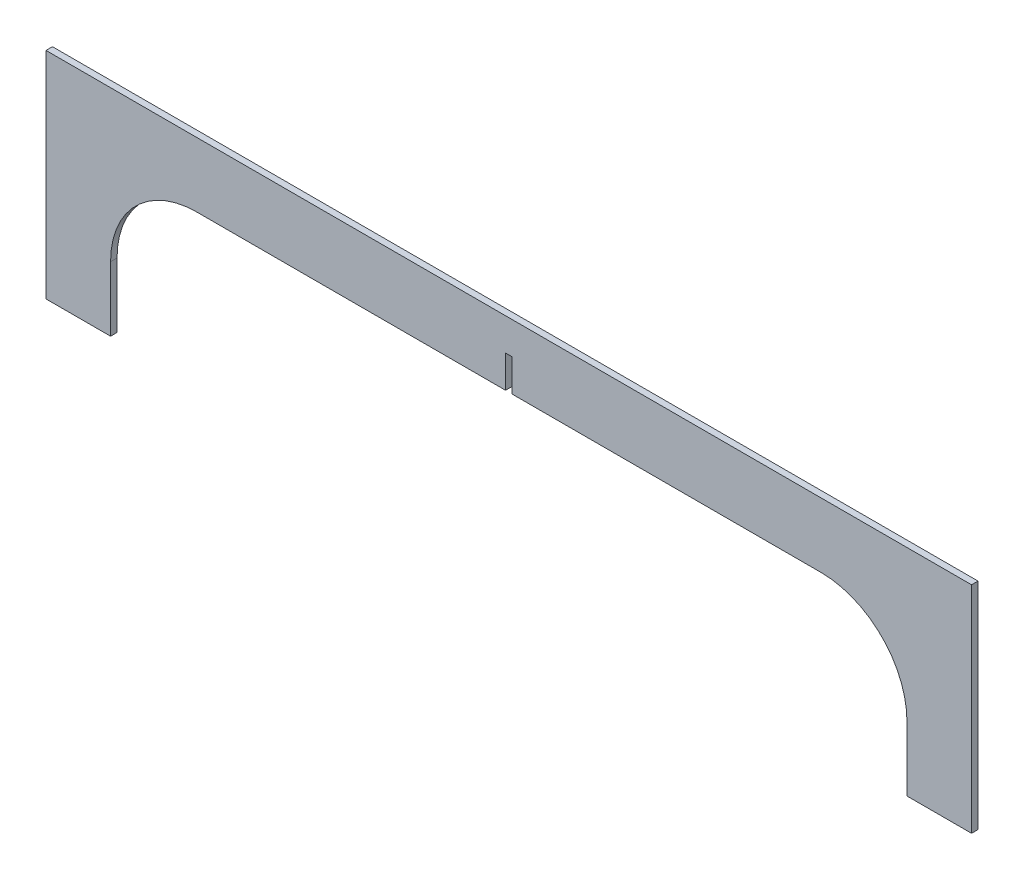
ISO-10303-21;
HEADER;
FILE_DESCRIPTION(('STEP AP214'),'2;1');
FILE_NAME('part.step','',(''),(''),'','','');
FILE_SCHEMA(('AUTOMOTIVE_DESIGN { 1 0 10303 214 1 1 1 1 }'));
ENDSEC;
DATA;
#1=APPLICATION_CONTEXT('core data for automotive mechanical design processes');
#2=APPLICATION_PROTOCOL_DEFINITION('international standard','automotive_design',2000,#1);
#3=PRODUCT_CONTEXT('',#1,'mechanical');
#4=PRODUCT('Part','Part','',(#3));
#5=PRODUCT_RELATED_PRODUCT_CATEGORY('part','',(#4));
#6=PRODUCT_DEFINITION_FORMATION('','',#4);
#7=PRODUCT_DEFINITION_CONTEXT('part definition',#1,'design');
#8=PRODUCT_DEFINITION('design','',#6,#7);
#9=PRODUCT_DEFINITION_SHAPE('','',#8);
#10=(LENGTH_UNIT() NAMED_UNIT(*) SI_UNIT(.MILLI.,.METRE.));
#11=(NAMED_UNIT(*) PLANE_ANGLE_UNIT() SI_UNIT($,.RADIAN.));
#12=(NAMED_UNIT(*) SI_UNIT($,.STERADIAN.) SOLID_ANGLE_UNIT());
#13=UNCERTAINTY_MEASURE_WITH_UNIT(LENGTH_MEASURE(1.E-05),#10,'distance_accuracy_value','');
#14=(GEOMETRIC_REPRESENTATION_CONTEXT(3) GLOBAL_UNCERTAINTY_ASSIGNED_CONTEXT((#13)) GLOBAL_UNIT_ASSIGNED_CONTEXT((#10,
#11,#12)) REPRESENTATION_CONTEXT('',''));
#15=CARTESIAN_POINT('',(0.,0.,0.));
#16=DIRECTION('',(0.,0.,1.));
#17=DIRECTION('',(1.,0.,0.));
#18=AXIS2_PLACEMENT_3D('',#15,#16,#17);
#19=CARTESIAN_POINT('',(30.,0.,3.));
#20=DIRECTION('',(0.,1.,0.));
#21=DIRECTION('',(-1.,0.,0.));
#22=AXIS2_PLACEMENT_3D('',#19,#20,#21);
#23=PLANE('',#22);
#24=DIRECTION('',(1.,0.,0.));
#25=VECTOR('',#24,1.);
#26=CARTESIAN_POINT('',(30.,0.,0.));
#27=LINE('',#26,#25);
#28=CARTESIAN_POINT('',(0.,0.,0.));
#29=VERTEX_POINT('',#28);
#30=CARTESIAN_POINT('',(30.,0.,0.));
#31=VERTEX_POINT('',#30);
#32=EDGE_CURVE('E155',#29,#31,#27,.T.);
#33=ORIENTED_EDGE('',*,*,#32,.T.);
#34=DIRECTION('',(0.,0.,-1.));
#35=VECTOR('',#34,1.);
#36=CARTESIAN_POINT('',(30.,0.,3.));
#37=LINE('',#36,#35);
#38=CARTESIAN_POINT('',(30.,0.,3.));
#39=VERTEX_POINT('',#38);
#40=EDGE_CURVE('E138',#39,#31,#37,.T.);
#41=ORIENTED_EDGE('',*,*,#40,.F.);
#42=DIRECTION('',(1.,0.,0.));
#43=VECTOR('',#42,1.);
#44=CARTESIAN_POINT('',(30.,0.,3.));
#45=LINE('',#44,#43);
#46=CARTESIAN_POINT('',(0.,0.,3.));
#47=VERTEX_POINT('',#46);
#48=EDGE_CURVE('E143',#47,#39,#45,.T.);
#49=ORIENTED_EDGE('',*,*,#48,.F.);
#50=DIRECTION('',(0.,0.,-1.));
#51=VECTOR('',#50,1.);
#52=CARTESIAN_POINT('',(0.,0.,3.));
#53=LINE('',#52,#51);
#54=EDGE_CURVE('E220',#47,#29,#53,.T.);
#55=ORIENTED_EDGE('',*,*,#54,.T.);
#56=EDGE_LOOP('',(#33,#41,#49,#55));
#57=FACE_BOUND('',#56,.T.);
#58=ADVANCED_FACE('F37',(#57),#23,.F.);
#59=CARTESIAN_POINT('',(30.,70.,3.));
#60=DIRECTION('',(-1.,0.,0.));
#61=DIRECTION('',(0.,-1.,0.));
#62=AXIS2_PLACEMENT_3D('',#59,#60,#61);
#63=PLANE('',#62);
#64=DIRECTION('',(0.,1.,0.));
#65=VECTOR('',#64,1.);
#66=CARTESIAN_POINT('',(30.,70.,0.));
#67=LINE('',#66,#65);
#68=CARTESIAN_POINT('',(30.,30.,0.));
#69=VERTEX_POINT('',#68);
#70=EDGE_CURVE('E251',#31,#69,#67,.T.);
#71=ORIENTED_EDGE('',*,*,#70,.T.);
#72=DIRECTION('',(0.,0.,-1.));
#73=VECTOR('',#72,1.);
#74=CARTESIAN_POINT('',(30.,30.,3.));
#75=LINE('',#74,#73);
#76=CARTESIAN_POINT('',(30.,30.,3.));
#77=VERTEX_POINT('',#76);
#78=EDGE_CURVE('E52',#69,#77,#75,.F.);
#79=ORIENTED_EDGE('',*,*,#78,.T.);
#80=DIRECTION('',(0.,1.,0.));
#81=VECTOR('',#80,1.);
#82=CARTESIAN_POINT('',(30.,70.,3.));
#83=LINE('',#82,#81);
#84=EDGE_CURVE('E134',#39,#77,#83,.T.);
#85=ORIENTED_EDGE('',*,*,#84,.F.);
#86=ORIENTED_EDGE('',*,*,#40,.T.);
#87=EDGE_LOOP('',(#71,#79,#85,#86));
#88=FACE_BOUND('',#87,.T.);
#89=ADVANCED_FACE('F136',(#88),#63,.F.);
#90=CARTESIAN_POINT('',(30.,70.,3.));
#91=DIRECTION('',(0.,1.,0.));
#92=DIRECTION('',(0.,0.,1.));
#93=AXIS2_PLACEMENT_3D('',#90,#91,#92);
#94=PLANE('',#93);
#95=DIRECTION('',(1.,0.,0.));
#96=VECTOR('',#95,1.);
#97=CARTESIAN_POINT('',(30.,70.,3.));
#98=LINE('',#97,#96);
#99=CARTESIAN_POINT('',(70.,70.,3.));
#100=VERTEX_POINT('',#99);
#101=CARTESIAN_POINT('',(213.5,70.,3.));
#102=VERTEX_POINT('',#101);
#103=EDGE_CURVE('E142',#100,#102,#98,.T.);
#104=ORIENTED_EDGE('',*,*,#103,.F.);
#105=DIRECTION('',(0.,0.,-1.));
#106=VECTOR('',#105,1.);
#107=CARTESIAN_POINT('',(70.,70.,0.));
#108=LINE('',#107,#106);
#109=CARTESIAN_POINT('',(70.,70.,0.));
#110=VERTEX_POINT('',#109);
#111=EDGE_CURVE('E168',#100,#110,#108,.T.);
#112=ORIENTED_EDGE('',*,*,#111,.T.);
#113=DIRECTION('',(1.,0.,0.));
#114=VECTOR('',#113,1.);
#115=CARTESIAN_POINT('',(30.,70.,0.));
#116=LINE('',#115,#114);
#117=CARTESIAN_POINT('',(213.5,70.,0.));
#118=VERTEX_POINT('',#117);
#119=EDGE_CURVE('E247',#110,#118,#116,.T.);
#120=ORIENTED_EDGE('',*,*,#119,.T.);
#121=DIRECTION('',(0.,0.,-1.));
#122=VECTOR('',#121,1.);
#123=CARTESIAN_POINT('',(213.5,70.,3.));
#124=LINE('',#123,#122);
#125=EDGE_CURVE('E157',#102,#118,#124,.T.);
#126=ORIENTED_EDGE('',*,*,#125,.F.);
#127=EDGE_LOOP('',(#104,#112,#120,#126));
#128=FACE_BOUND('',#127,.T.);
#129=ADVANCED_FACE('F270',(#128),#94,.F.);
#130=CARTESIAN_POINT('',(213.5,70.,3.));
#131=DIRECTION('',(-1.,0.,0.));
#132=DIRECTION('',(0.,0.,1.));
#133=AXIS2_PLACEMENT_3D('',#130,#131,#132);
#134=PLANE('',#133);
#135=DIRECTION('',(0.,1.,0.));
#136=VECTOR('',#135,1.);
#137=CARTESIAN_POINT('',(213.5,70.,0.));
#138=LINE('',#137,#136);
#139=CARTESIAN_POINT('',(213.5,85.,0.));
#140=VERTEX_POINT('',#139);
#141=EDGE_CURVE('E246',#118,#140,#138,.T.);
#142=ORIENTED_EDGE('',*,*,#141,.T.);
#143=DIRECTION('',(0.,0.,-1.));
#144=VECTOR('',#143,1.);
#145=CARTESIAN_POINT('',(213.5,85.,3.));
#146=LINE('',#145,#144);
#147=CARTESIAN_POINT('',(213.5,85.,3.));
#148=VERTEX_POINT('',#147);
#149=EDGE_CURVE('E163',#148,#140,#146,.T.);
#150=ORIENTED_EDGE('',*,*,#149,.F.);
#151=DIRECTION('',(0.,1.,0.));
#152=VECTOR('',#151,1.);
#153=CARTESIAN_POINT('',(213.5,70.,3.));
#154=LINE('',#153,#152);
#155=EDGE_CURVE('E264',#102,#148,#154,.T.);
#156=ORIENTED_EDGE('',*,*,#155,.F.);
#157=ORIENTED_EDGE('',*,*,#125,.T.);
#158=EDGE_LOOP('',(#142,#150,#156,#157));
#159=FACE_BOUND('',#158,.T.);
#160=ADVANCED_FACE('F271',(#159),#134,.F.);
#161=CARTESIAN_POINT('',(213.5,85.,3.));
#162=DIRECTION('',(0.,1.,0.));
#163=DIRECTION('',(0.,0.,1.));
#164=AXIS2_PLACEMENT_3D('',#161,#162,#163);
#165=PLANE('',#164);
#166=DIRECTION('',(1.,0.,0.));
#167=VECTOR('',#166,1.);
#168=CARTESIAN_POINT('',(213.5,85.,0.));
#169=LINE('',#168,#167);
#170=CARTESIAN_POINT('',(216.5,85.,0.));
#171=VERTEX_POINT('',#170);
#172=EDGE_CURVE('E210',#140,#171,#169,.T.);
#173=ORIENTED_EDGE('',*,*,#172,.T.);
#174=DIRECTION('',(0.,0.,-1.));
#175=VECTOR('',#174,1.);
#176=CARTESIAN_POINT('',(216.5,85.,3.));
#177=LINE('',#176,#175);
#178=CARTESIAN_POINT('',(216.5,85.,3.));
#179=VERTEX_POINT('',#178);
#180=EDGE_CURVE('E233',#179,#171,#177,.T.);
#181=ORIENTED_EDGE('',*,*,#180,.F.);
#182=DIRECTION('',(1.,0.,0.));
#183=VECTOR('',#182,1.);
#184=CARTESIAN_POINT('',(213.5,85.,3.));
#185=LINE('',#184,#183);
#186=EDGE_CURVE('E242',#148,#179,#185,.T.);
#187=ORIENTED_EDGE('',*,*,#186,.F.);
#188=ORIENTED_EDGE('',*,*,#149,.T.);
#189=EDGE_LOOP('',(#173,#181,#187,#188));
#190=FACE_BOUND('',#189,.T.);
#191=ADVANCED_FACE('F240',(#190),#165,.F.);
#192=CARTESIAN_POINT('',(216.5,85.,3.));
#193=DIRECTION('',(1.,0.,0.));
#194=DIRECTION('',(0.,0.,-1.));
#195=AXIS2_PLACEMENT_3D('',#192,#193,#194);
#196=PLANE('',#195);
#197=DIRECTION('',(0.,-1.,0.));
#198=VECTOR('',#197,1.);
#199=CARTESIAN_POINT('',(216.5,85.,0.));
#200=LINE('',#199,#198);
#201=CARTESIAN_POINT('',(216.5,70.,0.));
#202=VERTEX_POINT('',#201);
#203=EDGE_CURVE('E206',#171,#202,#200,.T.);
#204=ORIENTED_EDGE('',*,*,#203,.T.);
#205=DIRECTION('',(0.,0.,-1.));
#206=VECTOR('',#205,1.);
#207=CARTESIAN_POINT('',(216.5,70.,3.));
#208=LINE('',#207,#206);
#209=CARTESIAN_POINT('',(216.5,70.,3.));
#210=VERTEX_POINT('',#209);
#211=EDGE_CURVE('E205',#210,#202,#208,.T.);
#212=ORIENTED_EDGE('',*,*,#211,.F.);
#213=DIRECTION('',(0.,-1.,0.));
#214=VECTOR('',#213,1.);
#215=CARTESIAN_POINT('',(216.5,85.,3.));
#216=LINE('',#215,#214);
#217=EDGE_CURVE('E261',#179,#210,#216,.T.);
#218=ORIENTED_EDGE('',*,*,#217,.F.);
#219=ORIENTED_EDGE('',*,*,#180,.T.);
#220=EDGE_LOOP('',(#204,#212,#218,#219));
#221=FACE_BOUND('',#220,.T.);
#222=ADVANCED_FACE('F278',(#221),#196,.F.);
#223=CARTESIAN_POINT('',(216.5,70.,3.));
#224=DIRECTION('',(0.,1.,0.));
#225=DIRECTION('',(0.,0.,1.));
#226=AXIS2_PLACEMENT_3D('',#223,#224,#225);
#227=PLANE('',#226);
#228=DIRECTION('',(1.,0.,0.));
#229=VECTOR('',#228,1.);
#230=CARTESIAN_POINT('',(216.5,70.,0.));
#231=LINE('',#230,#229);
#232=CARTESIAN_POINT('',(360.,70.,0.));
#233=VERTEX_POINT('',#232);
#234=EDGE_CURVE('E198',#202,#233,#231,.T.);
#235=ORIENTED_EDGE('',*,*,#234,.T.);
#236=DIRECTION('',(0.,0.,-1.));
#237=VECTOR('',#236,1.);
#238=CARTESIAN_POINT('',(360.,70.,3.));
#239=LINE('',#238,#237);
#240=CARTESIAN_POINT('',(360.,70.,3.));
#241=VERTEX_POINT('',#240);
#242=EDGE_CURVE('E160',#233,#241,#239,.F.);
#243=ORIENTED_EDGE('',*,*,#242,.T.);
#244=DIRECTION('',(1.,0.,0.));
#245=VECTOR('',#244,1.);
#246=CARTESIAN_POINT('',(216.5,70.,3.));
#247=LINE('',#246,#245);
#248=EDGE_CURVE('E181',#210,#241,#247,.T.);
#249=ORIENTED_EDGE('',*,*,#248,.F.);
#250=ORIENTED_EDGE('',*,*,#211,.T.);
#251=EDGE_LOOP('',(#235,#243,#249,#250));
#252=FACE_BOUND('',#251,.T.);
#253=ADVANCED_FACE('F203',(#252),#227,.F.);
#254=CARTESIAN_POINT('',(400.,0.,3.));
#255=DIRECTION('',(1.,0.,0.));
#256=DIRECTION('',(0.,0.,-1.));
#257=AXIS2_PLACEMENT_3D('',#254,#255,#256);
#258=PLANE('',#257);
#259=DIRECTION('',(0.,-1.,0.));
#260=VECTOR('',#259,1.);
#261=CARTESIAN_POINT('',(400.,0.,3.));
#262=LINE('',#261,#260);
#263=CARTESIAN_POINT('',(400.,30.,3.));
#264=VERTEX_POINT('',#263);
#265=CARTESIAN_POINT('',(400.,0.,3.));
#266=VERTEX_POINT('',#265);
#267=EDGE_CURVE('E178',#264,#266,#262,.T.);
#268=ORIENTED_EDGE('',*,*,#267,.F.);
#269=DIRECTION('',(0.,0.,-1.));
#270=VECTOR('',#269,1.);
#271=CARTESIAN_POINT('',(400.,30.,0.));
#272=LINE('',#271,#270);
#273=CARTESIAN_POINT('',(400.,30.,0.));
#274=VERTEX_POINT('',#273);
#275=EDGE_CURVE('E156',#264,#274,#272,.T.);
#276=ORIENTED_EDGE('',*,*,#275,.T.);
#277=DIRECTION('',(0.,-1.,0.));
#278=VECTOR('',#277,1.);
#279=CARTESIAN_POINT('',(400.,0.,0.));
#280=LINE('',#279,#278);
#281=CARTESIAN_POINT('',(400.,0.,0.));
#282=VERTEX_POINT('',#281);
#283=EDGE_CURVE('E200',#274,#282,#280,.T.);
#284=ORIENTED_EDGE('',*,*,#283,.T.);
#285=DIRECTION('',(0.,0.,-1.));
#286=VECTOR('',#285,1.);
#287=CARTESIAN_POINT('',(400.,0.,3.));
#288=LINE('',#287,#286);
#289=EDGE_CURVE('E189',#266,#282,#288,.T.);
#290=ORIENTED_EDGE('',*,*,#289,.F.);
#291=EDGE_LOOP('',(#268,#276,#284,#290));
#292=FACE_BOUND('',#291,.T.);
#293=ADVANCED_FACE('F186',(#292),#258,.F.);
#294=CARTESIAN_POINT('',(430.,0.,3.));
#295=DIRECTION('',(0.,1.,0.));
#296=DIRECTION('',(-1.,0.,0.));
#297=AXIS2_PLACEMENT_3D('',#294,#295,#296);
#298=PLANE('',#297);
#299=DIRECTION('',(1.,0.,0.));
#300=VECTOR('',#299,1.);
#301=CARTESIAN_POINT('',(430.,0.,0.));
#302=LINE('',#301,#300);
#303=CARTESIAN_POINT('',(430.,0.,0.));
#304=VERTEX_POINT('',#303);
#305=EDGE_CURVE('E208',#282,#304,#302,.T.);
#306=ORIENTED_EDGE('',*,*,#305,.T.);
#307=DIRECTION('',(0.,0.,-1.));
#308=VECTOR('',#307,1.);
#309=CARTESIAN_POINT('',(430.,0.,3.));
#310=LINE('',#309,#308);
#311=CARTESIAN_POINT('',(430.,0.,3.));
#312=VERTEX_POINT('',#311);
#313=EDGE_CURVE('E228',#312,#304,#310,.T.);
#314=ORIENTED_EDGE('',*,*,#313,.F.);
#315=DIRECTION('',(1.,0.,0.));
#316=VECTOR('',#315,1.);
#317=CARTESIAN_POINT('',(430.,0.,3.));
#318=LINE('',#317,#316);
#319=EDGE_CURVE('E191',#266,#312,#318,.T.);
#320=ORIENTED_EDGE('',*,*,#319,.F.);
#321=ORIENTED_EDGE('',*,*,#289,.T.);
#322=EDGE_LOOP('',(#306,#314,#320,#321));
#323=FACE_BOUND('',#322,.T.);
#324=ADVANCED_FACE('F312',(#323),#298,.F.);
#325=CARTESIAN_POINT('',(430.,100.,3.));
#326=DIRECTION('',(-1.,0.,0.));
#327=DIRECTION('',(0.,0.,1.));
#328=AXIS2_PLACEMENT_3D('',#325,#326,#327);
#329=PLANE('',#328);
#330=DIRECTION('',(0.,1.,0.));
#331=VECTOR('',#330,1.);
#332=CARTESIAN_POINT('',(430.,100.,0.));
#333=LINE('',#332,#331);
#334=CARTESIAN_POINT('',(430.,100.,0.));
#335=VERTEX_POINT('',#334);
#336=EDGE_CURVE('E215',#304,#335,#333,.T.);
#337=ORIENTED_EDGE('',*,*,#336,.T.);
#338=DIRECTION('',(0.,0.,-1.));
#339=VECTOR('',#338,1.);
#340=CARTESIAN_POINT('',(430.,100.,3.));
#341=LINE('',#340,#339);
#342=CARTESIAN_POINT('',(430.,100.,3.));
#343=VERTEX_POINT('',#342);
#344=EDGE_CURVE('E225',#343,#335,#341,.T.);
#345=ORIENTED_EDGE('',*,*,#344,.F.);
#346=DIRECTION('',(0.,1.,0.));
#347=VECTOR('',#346,1.);
#348=CARTESIAN_POINT('',(430.,100.,3.));
#349=LINE('',#348,#347);
#350=EDGE_CURVE('E257',#312,#343,#349,.T.);
#351=ORIENTED_EDGE('',*,*,#350,.F.);
#352=ORIENTED_EDGE('',*,*,#313,.T.);
#353=EDGE_LOOP('',(#337,#345,#351,#352));
#354=FACE_BOUND('',#353,.T.);
#355=ADVANCED_FACE('F308',(#354),#329,.F.);
#356=CARTESIAN_POINT('',(0.,100.,3.));
#357=DIRECTION('',(0.,-1.,0.));
#358=DIRECTION('',(0.,0.,-1.));
#359=AXIS2_PLACEMENT_3D('',#356,#357,#358);
#360=PLANE('',#359);
#361=DIRECTION('',(-1.,0.,0.));
#362=VECTOR('',#361,1.);
#363=CARTESIAN_POINT('',(0.,100.,0.));
#364=LINE('',#363,#362);
#365=CARTESIAN_POINT('',(0.,100.,0.));
#366=VERTEX_POINT('',#365);
#367=EDGE_CURVE('E217',#335,#366,#364,.T.);
#368=ORIENTED_EDGE('',*,*,#367,.T.);
#369=DIRECTION('',(0.,0.,-1.));
#370=VECTOR('',#369,1.);
#371=CARTESIAN_POINT('',(0.,100.,3.));
#372=LINE('',#371,#370);
#373=CARTESIAN_POINT('',(0.,100.,3.));
#374=VERTEX_POINT('',#373);
#375=EDGE_CURVE('E222',#374,#366,#372,.T.);
#376=ORIENTED_EDGE('',*,*,#375,.F.);
#377=DIRECTION('',(-1.,0.,0.));
#378=VECTOR('',#377,1.);
#379=CARTESIAN_POINT('',(0.,100.,3.));
#380=LINE('',#379,#378);
#381=EDGE_CURVE('E255',#343,#374,#380,.T.);
#382=ORIENTED_EDGE('',*,*,#381,.F.);
#383=ORIENTED_EDGE('',*,*,#344,.T.);
#384=EDGE_LOOP('',(#368,#376,#382,#383));
#385=FACE_BOUND('',#384,.T.);
#386=ADVANCED_FACE('F304',(#385),#360,.F.);
#387=CARTESIAN_POINT('',(0.,0.,3.));
#388=DIRECTION('',(1.,0.,0.));
#389=DIRECTION('',(0.,0.,-1.));
#390=AXIS2_PLACEMENT_3D('',#387,#388,#389);
#391=PLANE('',#390);
#392=DIRECTION('',(0.,-1.,0.));
#393=VECTOR('',#392,1.);
#394=CARTESIAN_POINT('',(0.,0.,0.));
#395=LINE('',#394,#393);
#396=EDGE_CURVE('E152',#366,#29,#395,.T.);
#397=ORIENTED_EDGE('',*,*,#396,.T.);
#398=ORIENTED_EDGE('',*,*,#54,.F.);
#399=DIRECTION('',(0.,-1.,0.));
#400=VECTOR('',#399,1.);
#401=CARTESIAN_POINT('',(0.,0.,3.));
#402=LINE('',#401,#400);
#403=EDGE_CURVE('E148',#374,#47,#402,.T.);
#404=ORIENTED_EDGE('',*,*,#403,.F.);
#405=ORIENTED_EDGE('',*,*,#375,.T.);
#406=EDGE_LOOP('',(#397,#398,#404,#405));
#407=FACE_BOUND('',#406,.T.);
#408=ADVANCED_FACE('F299',(#407),#391,.F.);
#409=CARTESIAN_POINT('',(0.,0.,3.));
#410=DIRECTION('',(0.,0.,-1.));
#411=DIRECTION('',(-1.,0.,0.));
#412=AXIS2_PLACEMENT_3D('',#409,#410,#411);
#413=PLANE('',#412);
#414=ORIENTED_EDGE('',*,*,#48,.T.);
#415=ORIENTED_EDGE('',*,*,#84,.T.);
#416=CARTESIAN_POINT('',(70.,30.,3.));
#417=DIRECTION('',(0.,0.,-1.));
#418=DIRECTION('',(-1.,0.,0.));
#419=AXIS2_PLACEMENT_3D('',#416,#417,#418);
#420=CIRCLE('',#419,40.);
#421=EDGE_CURVE('E11',#77,#100,#420,.T.);
#422=ORIENTED_EDGE('',*,*,#421,.T.);
#423=ORIENTED_EDGE('',*,*,#103,.T.);
#424=ORIENTED_EDGE('',*,*,#155,.T.);
#425=ORIENTED_EDGE('',*,*,#186,.T.);
#426=ORIENTED_EDGE('',*,*,#217,.T.);
#427=ORIENTED_EDGE('',*,*,#248,.T.);
#428=CARTESIAN_POINT('',(360.,30.,3.));
#429=DIRECTION('',(0.,0.,-1.));
#430=DIRECTION('',(-1.,0.,0.));
#431=AXIS2_PLACEMENT_3D('',#428,#429,#430);
#432=CIRCLE('',#431,40.);
#433=EDGE_CURVE('E174',#241,#264,#432,.T.);
#434=ORIENTED_EDGE('',*,*,#433,.T.);
#435=ORIENTED_EDGE('',*,*,#267,.T.);
#436=ORIENTED_EDGE('',*,*,#319,.T.);
#437=ORIENTED_EDGE('',*,*,#350,.T.);
#438=ORIENTED_EDGE('',*,*,#381,.T.);
#439=ORIENTED_EDGE('',*,*,#403,.T.);
#440=EDGE_LOOP('',(#414,#415,#422,#423,#424,#425,#426,#427,#434,#435,#436,#437,#438,#439));
#441=FACE_BOUND('',#440,.T.);
#442=ADVANCED_FACE('F146',(#441),#413,.F.);
#443=CARTESIAN_POINT('',(0.,0.,0.));
#444=DIRECTION('',(0.,0.,-1.));
#445=DIRECTION('',(-1.,0.,0.));
#446=AXIS2_PLACEMENT_3D('',#443,#444,#445);
#447=PLANE('',#446);
#448=ORIENTED_EDGE('',*,*,#32,.F.);
#449=ORIENTED_EDGE('',*,*,#396,.F.);
#450=ORIENTED_EDGE('',*,*,#367,.F.);
#451=ORIENTED_EDGE('',*,*,#336,.F.);
#452=ORIENTED_EDGE('',*,*,#305,.F.);
#453=ORIENTED_EDGE('',*,*,#283,.F.);
#454=CARTESIAN_POINT('',(360.,30.,0.));
#455=DIRECTION('',(0.,0.,-1.));
#456=DIRECTION('',(-1.,0.,0.));
#457=AXIS2_PLACEMENT_3D('',#454,#455,#456);
#458=CIRCLE('',#457,40.);
#459=EDGE_CURVE('E172',#274,#233,#458,.F.);
#460=ORIENTED_EDGE('',*,*,#459,.T.);
#461=ORIENTED_EDGE('',*,*,#234,.F.);
#462=ORIENTED_EDGE('',*,*,#203,.F.);
#463=ORIENTED_EDGE('',*,*,#172,.F.);
#464=ORIENTED_EDGE('',*,*,#141,.F.);
#465=ORIENTED_EDGE('',*,*,#119,.F.);
#466=CARTESIAN_POINT('',(70.,30.,0.));
#467=DIRECTION('',(0.,0.,-1.));
#468=DIRECTION('',(-1.,0.,0.));
#469=AXIS2_PLACEMENT_3D('',#466,#467,#468);
#470=CIRCLE('',#469,40.);
#471=EDGE_CURVE('E45',#110,#69,#470,.F.);
#472=ORIENTED_EDGE('',*,*,#471,.T.);
#473=ORIENTED_EDGE('',*,*,#70,.F.);
#474=EDGE_LOOP('',(#448,#449,#450,#451,#452,#453,#460,#461,#462,#463,#464,#465,#472,#473));
#475=FACE_BOUND('',#474,.T.);
#476=ADVANCED_FACE('F196',(#475),#447,.T.);
#477=CARTESIAN_POINT('',(360.,30.,3.));
#478=DIRECTION('',(0.,0.,1.));
#479=DIRECTION('',(1.,0.,0.));
#480=AXIS2_PLACEMENT_3D('',#477,#478,#479);
#481=CYLINDRICAL_SURFACE('',#480,40.);
#482=ORIENTED_EDGE('',*,*,#433,.F.);
#483=ORIENTED_EDGE('',*,*,#242,.F.);
#484=ORIENTED_EDGE('',*,*,#459,.F.);
#485=ORIENTED_EDGE('',*,*,#275,.F.);
#486=EDGE_LOOP('',(#482,#483,#484,#485));
#487=FACE_BOUND('',#486,.T.);
#488=ADVANCED_FACE('F193',(#487),#481,.F.);
#489=CARTESIAN_POINT('',(70.,30.,3.));
#490=DIRECTION('',(0.,0.,1.));
#491=DIRECTION('',(1.,0.,0.));
#492=AXIS2_PLACEMENT_3D('',#489,#490,#491);
#493=CYLINDRICAL_SURFACE('',#492,40.);
#494=ORIENTED_EDGE('',*,*,#421,.F.);
#495=ORIENTED_EDGE('',*,*,#78,.F.);
#496=ORIENTED_EDGE('',*,*,#471,.F.);
#497=ORIENTED_EDGE('',*,*,#111,.F.);
#498=EDGE_LOOP('',(#494,#495,#496,#497));
#499=FACE_BOUND('',#498,.T.);
#500=ADVANCED_FACE('F39',(#499),#493,.F.);
#501=CLOSED_SHELL('',(#58,#89,#129,#160,#191,#222,#253,#293,#324,#355,#386,#408,#442,#476,#488,#500));
#502=MANIFOLD_SOLID_BREP('B2',#501);
#503=ADVANCED_BREP_SHAPE_REPRESENTATION('',(#18,#502),#14);
#504=SHAPE_DEFINITION_REPRESENTATION(#9,#503);
ENDSEC;
END-ISO-10303-21;
